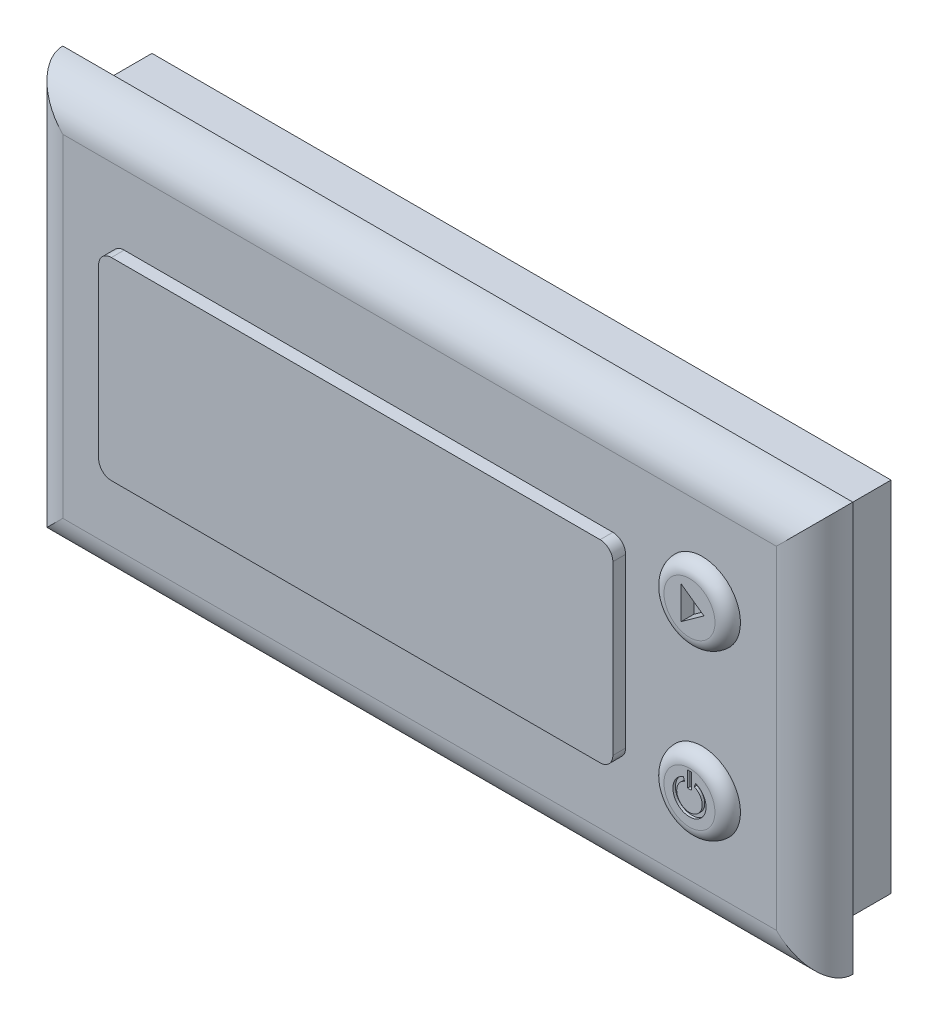
ISO-10303-21;
HEADER;
FILE_DESCRIPTION(('STEP AP214'),'2;1');
FILE_NAME('part.step','',(''),(''),'','','');
FILE_SCHEMA(('AUTOMOTIVE_DESIGN { 1 0 10303 214 1 1 1 1 }'));
ENDSEC;
DATA;
#1=APPLICATION_CONTEXT('core data for automotive mechanical design processes');
#2=APPLICATION_PROTOCOL_DEFINITION('international standard','automotive_design',2000,#1);
#3=PRODUCT_CONTEXT('',#1,'mechanical');
#4=PRODUCT('Part','Part','',(#3));
#5=PRODUCT_RELATED_PRODUCT_CATEGORY('part','',(#4));
#6=PRODUCT_DEFINITION_FORMATION('','',#4);
#7=PRODUCT_DEFINITION_CONTEXT('part definition',#1,'design');
#8=PRODUCT_DEFINITION('design','',#6,#7);
#9=PRODUCT_DEFINITION_SHAPE('','',#8);
#10=(LENGTH_UNIT() NAMED_UNIT(*) SI_UNIT(.MILLI.,.METRE.));
#11=(NAMED_UNIT(*) PLANE_ANGLE_UNIT() SI_UNIT($,.RADIAN.));
#12=(NAMED_UNIT(*) SI_UNIT($,.STERADIAN.) SOLID_ANGLE_UNIT());
#13=UNCERTAINTY_MEASURE_WITH_UNIT(LENGTH_MEASURE(1.E-05),#10,'distance_accuracy_value','');
#14=(GEOMETRIC_REPRESENTATION_CONTEXT(3) GLOBAL_UNCERTAINTY_ASSIGNED_CONTEXT((#13)) GLOBAL_UNIT_ASSIGNED_CONTEXT((#10,
#11,#12)) REPRESENTATION_CONTEXT('',''));
#15=CARTESIAN_POINT('',(0.,0.,0.));
#16=DIRECTION('',(0.,0.,1.));
#17=DIRECTION('',(1.,0.,0.));
#18=AXIS2_PLACEMENT_3D('',#15,#16,#17);
#19=CARTESIAN_POINT('',(0.,0.,8.));
#20=DIRECTION('',(0.,0.,1.));
#21=DIRECTION('',(1.,0.,0.));
#22=AXIS2_PLACEMENT_3D('',#19,#20,#21);
#23=PLANE('',#22);
#24=CARTESIAN_POINT('',(22.1817440953964,-6.44740453375229,8.));
#25=DIRECTION('',(0.,0.,1.));
#26=DIRECTION('',(1.,0.,0.));
#27=AXIS2_PLACEMENT_3D('',#24,#25,#26);
#28=CIRCLE('',#27,3.0006169351865);
#29=CARTESIAN_POINT('',(25.1823610305829,-6.44740453375229,8.));
#30=VERTEX_POINT('',#29);
#31=EDGE_CURVE('E456',#30,#30,#28,.T.);
#32=ORIENTED_EDGE('',*,*,#31,.F.);
#33=EDGE_LOOP('',(#32));
#34=FACE_BOUND('',#33,.T.);
#35=CARTESIAN_POINT('',(22.1817440953964,6.44740453375228,8.));
#36=DIRECTION('',(0.,0.,1.));
#37=DIRECTION('',(1.,0.,0.));
#38=AXIS2_PLACEMENT_3D('',#35,#36,#37);
#39=CIRCLE('',#38,3.0006169351865);
#40=CARTESIAN_POINT('',(25.1823610305829,6.44740453375228,8.));
#41=VERTEX_POINT('',#40);
#42=EDGE_CURVE('E340',#41,#41,#39,.T.);
#43=ORIENTED_EDGE('',*,*,#42,.F.);
#44=EDGE_LOOP('',(#43));
#45=FACE_BOUND('',#44,.T.);
#46=DIRECTION('',(0.,-1.,0.));
#47=VECTOR('',#46,1.);
#48=CARTESIAN_POINT('',(-28.,-16.05,8.));
#49=LINE('',#48,#47);
#50=CARTESIAN_POINT('',(-28.,13.05,8.));
#51=VERTEX_POINT('',#50);
#52=CARTESIAN_POINT('',(-28.,-13.05,8.));
#53=VERTEX_POINT('',#52);
#54=EDGE_CURVE('E449',#51,#53,#49,.T.);
#55=ORIENTED_EDGE('',*,*,#54,.T.);
#56=DIRECTION('',(1.,0.,0.));
#57=VECTOR('',#56,1.);
#58=CARTESIAN_POINT('',(31.,-13.05,8.));
#59=LINE('',#58,#57);
#60=CARTESIAN_POINT('',(28.,-13.05,8.));
#61=VERTEX_POINT('',#60);
#62=EDGE_CURVE('E452',#53,#61,#59,.T.);
#63=ORIENTED_EDGE('',*,*,#62,.T.);
#64=DIRECTION('',(0.,1.,0.));
#65=VECTOR('',#64,1.);
#66=CARTESIAN_POINT('',(28.,16.05,8.));
#67=LINE('',#66,#65);
#68=CARTESIAN_POINT('',(28.,13.05,8.));
#69=VERTEX_POINT('',#68);
#70=EDGE_CURVE('E443',#61,#69,#67,.T.);
#71=ORIENTED_EDGE('',*,*,#70,.T.);
#72=DIRECTION('',(-1.,0.,0.));
#73=VECTOR('',#72,1.);
#74=CARTESIAN_POINT('',(-31.,13.05,8.));
#75=LINE('',#74,#73);
#76=EDGE_CURVE('E446',#69,#51,#75,.T.);
#77=ORIENTED_EDGE('',*,*,#76,.T.);
#78=EDGE_LOOP('',(#55,#63,#71,#77));
#79=FACE_BOUND('',#78,.T.);
#80=DIRECTION('',(1.,0.,0.));
#81=VECTOR('',#80,1.);
#82=CARTESIAN_POINT('',(-24.1861185618479,-7.58321673140807,8.));
#83=LINE('',#82,#81);
#84=CARTESIAN_POINT('',(-23.1861185618479,-7.58321673140807,8.));
#85=VERTEX_POINT('',#84);
#86=CARTESIAN_POINT('',(15.1686206960419,-7.58321673140807,8.));
#87=VERTEX_POINT('',#86);
#88=EDGE_CURVE('E372',#85,#87,#83,.T.);
#89=ORIENTED_EDGE('',*,*,#88,.F.);
#90=CARTESIAN_POINT('',(-23.1861185618479,-6.58321673140807,8.));
#91=DIRECTION('',(0.,0.,1.));
#92=DIRECTION('',(1.,0.,0.));
#93=AXIS2_PLACEMENT_3D('',#90,#91,#92);
#94=CIRCLE('',#93,1.);
#95=CARTESIAN_POINT('',(-24.1861185618479,-6.58321673140807,8.));
#96=VERTEX_POINT('',#95);
#97=EDGE_CURVE('E522',#85,#96,#94,.F.);
#98=ORIENTED_EDGE('',*,*,#97,.T.);
#99=DIRECTION('',(0.,-1.,0.));
#100=VECTOR('',#99,1.);
#101=CARTESIAN_POINT('',(-24.1861185618479,7.58321673140807,8.));
#102=LINE('',#101,#100);
#103=CARTESIAN_POINT('',(-24.1861185618479,6.58321673140807,8.));
#104=VERTEX_POINT('',#103);
#105=EDGE_CURVE('E350',#104,#96,#102,.T.);
#106=ORIENTED_EDGE('',*,*,#105,.F.);
#107=CARTESIAN_POINT('',(-23.1861185618479,6.58321673140807,8.));
#108=DIRECTION('',(0.,0.,1.));
#109=DIRECTION('',(1.,0.,0.));
#110=AXIS2_PLACEMENT_3D('',#107,#108,#109);
#111=CIRCLE('',#110,1.);
#112=CARTESIAN_POINT('',(-23.1861185618479,7.58321673140807,8.));
#113=VERTEX_POINT('',#112);
#114=EDGE_CURVE('E519',#104,#113,#111,.F.);
#115=ORIENTED_EDGE('',*,*,#114,.T.);
#116=DIRECTION('',(1.,0.,0.));
#117=VECTOR('',#116,1.);
#118=CARTESIAN_POINT('',(-24.1861185618479,7.58321673140807,8.));
#119=LINE('',#118,#117);
#120=CARTESIAN_POINT('',(15.1686206960419,7.58321673140807,8.));
#121=VERTEX_POINT('',#120);
#122=EDGE_CURVE('E356',#113,#121,#119,.T.);
#123=ORIENTED_EDGE('',*,*,#122,.T.);
#124=CARTESIAN_POINT('',(15.1686206960419,6.58321673140807,8.));
#125=DIRECTION('',(0.,0.,1.));
#126=DIRECTION('',(1.,0.,0.));
#127=AXIS2_PLACEMENT_3D('',#124,#125,#126);
#128=CIRCLE('',#127,1.);
#129=CARTESIAN_POINT('',(16.1686206960419,6.58321673140807,8.));
#130=VERTEX_POINT('',#129);
#131=EDGE_CURVE('E11',#121,#130,#128,.F.);
#132=ORIENTED_EDGE('',*,*,#131,.T.);
#133=DIRECTION('',(0.,-1.,0.));
#134=VECTOR('',#133,1.);
#135=CARTESIAN_POINT('',(16.1686206960419,7.58321673140807,8.));
#136=LINE('',#135,#134);
#137=CARTESIAN_POINT('',(16.1686206960419,-6.58321673140807,8.));
#138=VERTEX_POINT('',#137);
#139=EDGE_CURVE('E376',#130,#138,#136,.T.);
#140=ORIENTED_EDGE('',*,*,#139,.T.);
#141=CARTESIAN_POINT('',(15.1686206960419,-6.58321673140807,8.));
#142=DIRECTION('',(0.,0.,1.));
#143=DIRECTION('',(1.,0.,0.));
#144=AXIS2_PLACEMENT_3D('',#141,#142,#143);
#145=CIRCLE('',#144,1.);
#146=EDGE_CURVE('E52',#138,#87,#145,.F.);
#147=ORIENTED_EDGE('',*,*,#146,.T.);
#148=EDGE_LOOP('',(#89,#98,#106,#115,#123,#132,#140,#147));
#149=FACE_BOUND('',#148,.T.);
#150=ADVANCED_FACE('F43',(#34,#45,#79,#149),#23,.T.);
#151=CARTESIAN_POINT('',(-29.,-14.05,5.));
#152=DIRECTION('',(1.,0.,0.));
#153=DIRECTION('',(0.,0.,-1.));
#154=AXIS2_PLACEMENT_3D('',#151,#152,#153);
#155=PLANE('',#154);
#156=DIRECTION('',(0.,-1.,0.));
#157=VECTOR('',#156,1.);
#158=CARTESIAN_POINT('',(-29.,-14.05,0.));
#159=LINE('',#158,#157);
#160=CARTESIAN_POINT('',(-29.,14.05,0.));
#161=VERTEX_POINT('',#160);
#162=CARTESIAN_POINT('',(-29.,-14.05,0.));
#163=VERTEX_POINT('',#162);
#164=EDGE_CURVE('E398',#161,#163,#159,.T.);
#165=ORIENTED_EDGE('',*,*,#164,.T.);
#166=DIRECTION('',(0.,0.,-1.));
#167=VECTOR('',#166,1.);
#168=CARTESIAN_POINT('',(-29.,-14.05,5.));
#169=LINE('',#168,#167);
#170=CARTESIAN_POINT('',(-29.,-14.05,5.));
#171=VERTEX_POINT('',#170);
#172=EDGE_CURVE('E439',#171,#163,#169,.T.);
#173=ORIENTED_EDGE('',*,*,#172,.F.);
#174=DIRECTION('',(0.,-1.,0.));
#175=VECTOR('',#174,1.);
#176=CARTESIAN_POINT('',(-29.,-14.05,5.));
#177=LINE('',#176,#175);
#178=CARTESIAN_POINT('',(-29.,14.05,5.));
#179=VERTEX_POINT('',#178);
#180=EDGE_CURVE('E399',#179,#171,#177,.T.);
#181=ORIENTED_EDGE('',*,*,#180,.F.);
#182=DIRECTION('',(0.,0.,-1.));
#183=VECTOR('',#182,1.);
#184=CARTESIAN_POINT('',(-29.,14.05,5.));
#185=LINE('',#184,#183);
#186=EDGE_CURVE('E416',#179,#161,#185,.T.);
#187=ORIENTED_EDGE('',*,*,#186,.T.);
#188=EDGE_LOOP('',(#165,#173,#181,#187));
#189=FACE_BOUND('',#188,.T.);
#190=ADVANCED_FACE('F567',(#189),#155,.F.);
#191=CARTESIAN_POINT('',(29.,-14.05,5.));
#192=DIRECTION('',(0.,1.,0.));
#193=DIRECTION('',(-1.,0.,0.));
#194=AXIS2_PLACEMENT_3D('',#191,#192,#193);
#195=PLANE('',#194);
#196=DIRECTION('',(1.,0.,0.));
#197=VECTOR('',#196,1.);
#198=CARTESIAN_POINT('',(29.,-14.05,0.));
#199=LINE('',#198,#197);
#200=CARTESIAN_POINT('',(29.,-14.05,0.));
#201=VERTEX_POINT('',#200);
#202=EDGE_CURVE('E420',#163,#201,#199,.T.);
#203=ORIENTED_EDGE('',*,*,#202,.T.);
#204=DIRECTION('',(0.,0.,-1.));
#205=VECTOR('',#204,1.);
#206=CARTESIAN_POINT('',(29.,-14.05,5.));
#207=LINE('',#206,#205);
#208=CARTESIAN_POINT('',(29.,-14.05,5.));
#209=VERTEX_POINT('',#208);
#210=EDGE_CURVE('E435',#209,#201,#207,.T.);
#211=ORIENTED_EDGE('',*,*,#210,.F.);
#212=DIRECTION('',(1.,0.,0.));
#213=VECTOR('',#212,1.);
#214=CARTESIAN_POINT('',(29.,-14.05,5.));
#215=LINE('',#214,#213);
#216=EDGE_CURVE('E403',#171,#209,#215,.T.);
#217=ORIENTED_EDGE('',*,*,#216,.F.);
#218=ORIENTED_EDGE('',*,*,#172,.T.);
#219=EDGE_LOOP('',(#203,#211,#217,#218));
#220=FACE_BOUND('',#219,.T.);
#221=ADVANCED_FACE('F573',(#220),#195,.F.);
#222=CARTESIAN_POINT('',(29.,-14.05,5.));
#223=DIRECTION('',(-1.,0.,0.));
#224=DIRECTION('',(0.,0.,1.));
#225=AXIS2_PLACEMENT_3D('',#222,#223,#224);
#226=PLANE('',#225);
#227=DIRECTION('',(0.,1.,0.));
#228=VECTOR('',#227,1.);
#229=CARTESIAN_POINT('',(29.,-14.05,0.));
#230=LINE('',#229,#228);
#231=CARTESIAN_POINT('',(29.,14.05,0.));
#232=VERTEX_POINT('',#231);
#233=EDGE_CURVE('E423',#201,#232,#230,.T.);
#234=ORIENTED_EDGE('',*,*,#233,.T.);
#235=DIRECTION('',(0.,0.,-1.));
#236=VECTOR('',#235,1.);
#237=CARTESIAN_POINT('',(29.,14.05,5.));
#238=LINE('',#237,#236);
#239=CARTESIAN_POINT('',(29.,14.05,5.));
#240=VERTEX_POINT('',#239);
#241=EDGE_CURVE('E431',#240,#232,#238,.T.);
#242=ORIENTED_EDGE('',*,*,#241,.F.);
#243=DIRECTION('',(0.,1.,0.));
#244=VECTOR('',#243,1.);
#245=CARTESIAN_POINT('',(29.,-14.05,5.));
#246=LINE('',#245,#244);
#247=EDGE_CURVE('E408',#209,#240,#246,.T.);
#248=ORIENTED_EDGE('',*,*,#247,.F.);
#249=ORIENTED_EDGE('',*,*,#210,.T.);
#250=EDGE_LOOP('',(#234,#242,#248,#249));
#251=FACE_BOUND('',#250,.T.);
#252=ADVANCED_FACE('F593',(#251),#226,.F.);
#253=CARTESIAN_POINT('',(29.,14.05,5.));
#254=DIRECTION('',(0.,-1.,0.));
#255=DIRECTION('',(1.,0.,0.));
#256=AXIS2_PLACEMENT_3D('',#253,#254,#255);
#257=PLANE('',#256);
#258=DIRECTION('',(-1.,0.,0.));
#259=VECTOR('',#258,1.);
#260=CARTESIAN_POINT('',(29.,14.05,0.));
#261=LINE('',#260,#259);
#262=EDGE_CURVE('E404',#232,#161,#261,.T.);
#263=ORIENTED_EDGE('',*,*,#262,.T.);
#264=ORIENTED_EDGE('',*,*,#186,.F.);
#265=DIRECTION('',(-1.,0.,0.));
#266=VECTOR('',#265,1.);
#267=CARTESIAN_POINT('',(29.,14.05,5.));
#268=LINE('',#267,#266);
#269=EDGE_CURVE('E412',#240,#179,#268,.T.);
#270=ORIENTED_EDGE('',*,*,#269,.F.);
#271=ORIENTED_EDGE('',*,*,#241,.T.);
#272=EDGE_LOOP('',(#263,#264,#270,#271));
#273=FACE_BOUND('',#272,.T.);
#274=ADVANCED_FACE('F589',(#273),#257,.F.);
#275=CARTESIAN_POINT('',(0.,0.,0.));
#276=DIRECTION('',(0.,0.,1.));
#277=DIRECTION('',(1.,0.,0.));
#278=AXIS2_PLACEMENT_3D('',#275,#276,#277);
#279=PLANE('',#278);
#280=ORIENTED_EDGE('',*,*,#164,.F.);
#281=ORIENTED_EDGE('',*,*,#262,.F.);
#282=ORIENTED_EDGE('',*,*,#233,.F.);
#283=ORIENTED_EDGE('',*,*,#202,.F.);
#284=EDGE_LOOP('',(#280,#281,#282,#283));
#285=FACE_BOUND('',#284,.T.);
#286=ADVANCED_FACE('F585',(#285),#279,.F.);
#287=CARTESIAN_POINT('',(0.,0.,5.));
#288=DIRECTION('',(0.,0.,1.));
#289=DIRECTION('',(1.,0.,0.));
#290=AXIS2_PLACEMENT_3D('',#287,#288,#289);
#291=PLANE('',#290);
#292=DIRECTION('',(0.,1.,0.));
#293=VECTOR('',#292,1.);
#294=CARTESIAN_POINT('',(31.,-16.05,5.));
#295=LINE('',#294,#293);
#296=CARTESIAN_POINT('',(31.,-16.05,5.));
#297=VERTEX_POINT('',#296);
#298=CARTESIAN_POINT('',(31.,16.05,5.));
#299=VERTEX_POINT('',#298);
#300=EDGE_CURVE('E381',#297,#299,#295,.T.);
#301=ORIENTED_EDGE('',*,*,#300,.F.);
#302=DIRECTION('',(1.,0.,0.));
#303=VECTOR('',#302,1.);
#304=CARTESIAN_POINT('',(-31.,-16.05,5.));
#305=LINE('',#304,#303);
#306=CARTESIAN_POINT('',(-31.,-16.05,5.));
#307=VERTEX_POINT('',#306);
#308=EDGE_CURVE('E394',#307,#297,#305,.T.);
#309=ORIENTED_EDGE('',*,*,#308,.F.);
#310=DIRECTION('',(0.,-1.,0.));
#311=VECTOR('',#310,1.);
#312=CARTESIAN_POINT('',(-31.,16.05,5.));
#313=LINE('',#312,#311);
#314=CARTESIAN_POINT('',(-31.,16.05,5.));
#315=VERTEX_POINT('',#314);
#316=EDGE_CURVE('E390',#315,#307,#313,.T.);
#317=ORIENTED_EDGE('',*,*,#316,.F.);
#318=DIRECTION('',(-1.,0.,0.));
#319=VECTOR('',#318,1.);
#320=CARTESIAN_POINT('',(31.,16.05,5.));
#321=LINE('',#320,#319);
#322=EDGE_CURVE('E385',#299,#315,#321,.T.);
#323=ORIENTED_EDGE('',*,*,#322,.F.);
#324=EDGE_LOOP('',(#301,#309,#317,#323));
#325=FACE_BOUND('',#324,.T.);
#326=ORIENTED_EDGE('',*,*,#269,.T.);
#327=ORIENTED_EDGE('',*,*,#180,.T.);
#328=ORIENTED_EDGE('',*,*,#216,.T.);
#329=ORIENTED_EDGE('',*,*,#247,.T.);
#330=EDGE_LOOP('',(#326,#327,#328,#329));
#331=FACE_BOUND('',#330,.T.);
#332=ADVANCED_FACE('F581',(#325,#331),#291,.F.);
#333=CARTESIAN_POINT('',(0.,13.05,5.));
#334=DIRECTION('',(1.,0.,0.));
#335=DIRECTION('',(0.,0.,-1.));
#336=AXIS2_PLACEMENT_3D('',#333,#334,#335);
#337=CYLINDRICAL_SURFACE('',#336,3.);
#338=CARTESIAN_POINT('',(28.,13.05,5.));
#339=DIRECTION('',(0.707106781186547,-0.707106781186547,0.));
#340=DIRECTION('',(-0.707106781186547,-0.707106781186547,0.));
#341=AXIS2_PLACEMENT_3D('',#338,#339,#340);
#342=ELLIPSE('',#341,4.24264068711928,3.);
#343=EDGE_CURVE('E462',#299,#69,#342,.T.);
#344=ORIENTED_EDGE('',*,*,#343,.F.);
#345=ORIENTED_EDGE('',*,*,#322,.T.);
#346=CARTESIAN_POINT('',(-28.,13.05,5.));
#347=DIRECTION('',(0.707106781186547,0.707106781186547,0.));
#348=DIRECTION('',(0.707106781186547,-0.707106781186547,0.));
#349=AXIS2_PLACEMENT_3D('',#346,#347,#348);
#350=ELLIPSE('',#349,4.24264068711928,3.);
#351=EDGE_CURVE('E386',#51,#315,#350,.F.);
#352=ORIENTED_EDGE('',*,*,#351,.F.);
#353=ORIENTED_EDGE('',*,*,#76,.F.);
#354=EDGE_LOOP('',(#344,#345,#352,#353));
#355=FACE_BOUND('',#354,.T.);
#356=ADVANCED_FACE('F584',(#355),#337,.T.);
#357=CARTESIAN_POINT('',(-28.,0.,5.));
#358=DIRECTION('',(0.,1.,0.));
#359=DIRECTION('',(0.,0.,1.));
#360=AXIS2_PLACEMENT_3D('',#357,#358,#359);
#361=CYLINDRICAL_SURFACE('',#360,3.);
#362=ORIENTED_EDGE('',*,*,#351,.T.);
#363=ORIENTED_EDGE('',*,*,#316,.T.);
#364=CARTESIAN_POINT('',(-28.,-13.05,5.));
#365=DIRECTION('',(-0.707106781186547,0.707106781186547,0.));
#366=DIRECTION('',(0.707106781186547,0.707106781186547,0.));
#367=AXIS2_PLACEMENT_3D('',#364,#365,#366);
#368=ELLIPSE('',#367,4.24264068711928,3.);
#369=EDGE_CURVE('E459',#53,#307,#368,.F.);
#370=ORIENTED_EDGE('',*,*,#369,.F.);
#371=ORIENTED_EDGE('',*,*,#54,.F.);
#372=EDGE_LOOP('',(#362,#363,#370,#371));
#373=FACE_BOUND('',#372,.T.);
#374=ADVANCED_FACE('F608',(#373),#361,.T.);
#375=CARTESIAN_POINT('',(28.,0.,5.));
#376=DIRECTION('',(0.,-1.,0.));
#377=DIRECTION('',(0.,0.,-1.));
#378=AXIS2_PLACEMENT_3D('',#375,#376,#377);
#379=CYLINDRICAL_SURFACE('',#378,3.);
#380=ORIENTED_EDGE('',*,*,#343,.T.);
#381=ORIENTED_EDGE('',*,*,#70,.F.);
#382=CARTESIAN_POINT('',(28.,-13.05,5.));
#383=DIRECTION('',(-0.707106781186547,-0.707106781186547,0.));
#384=DIRECTION('',(0.707106781186547,-0.707106781186547,0.));
#385=AXIS2_PLACEMENT_3D('',#382,#383,#384);
#386=ELLIPSE('',#385,4.24264068711928,3.);
#387=EDGE_CURVE('E368',#297,#61,#386,.T.);
#388=ORIENTED_EDGE('',*,*,#387,.F.);
#389=ORIENTED_EDGE('',*,*,#300,.T.);
#390=EDGE_LOOP('',(#380,#381,#388,#389));
#391=FACE_BOUND('',#390,.T.);
#392=ADVANCED_FACE('F604',(#391),#379,.T.);
#393=CARTESIAN_POINT('',(0.,-13.05,5.));
#394=DIRECTION('',(-1.,0.,0.));
#395=DIRECTION('',(0.,0.,1.));
#396=AXIS2_PLACEMENT_3D('',#393,#394,#395);
#397=CYLINDRICAL_SURFACE('',#396,3.);
#398=ORIENTED_EDGE('',*,*,#369,.T.);
#399=ORIENTED_EDGE('',*,*,#308,.T.);
#400=ORIENTED_EDGE('',*,*,#387,.T.);
#401=ORIENTED_EDGE('',*,*,#62,.F.);
#402=EDGE_LOOP('',(#398,#399,#400,#401));
#403=FACE_BOUND('',#402,.T.);
#404=ADVANCED_FACE('F601',(#403),#397,.T.);
#405=CARTESIAN_POINT('',(-24.1861185618479,7.58321673140807,9.));
#406=DIRECTION('',(1.,0.,0.));
#407=DIRECTION('',(0.,0.,-1.));
#408=AXIS2_PLACEMENT_3D('',#405,#406,#407);
#409=PLANE('',#408);
#410=DIRECTION('',(0.,-1.,0.));
#411=VECTOR('',#410,1.);
#412=CARTESIAN_POINT('',(-24.1861185618479,7.58321673140807,9.));
#413=LINE('',#412,#411);
#414=CARTESIAN_POINT('',(-24.1861185618479,6.58321673140807,9.));
#415=VERTEX_POINT('',#414);
#416=CARTESIAN_POINT('',(-24.1861185618479,-6.58321673140807,9.));
#417=VERTEX_POINT('',#416);
#418=EDGE_CURVE('E351',#415,#417,#413,.T.);
#419=ORIENTED_EDGE('',*,*,#418,.F.);
#420=DIRECTION('',(0.,0.,-1.));
#421=VECTOR('',#420,1.);
#422=CARTESIAN_POINT('',(-24.1861185618479,6.58321673140807,8.));
#423=LINE('',#422,#421);
#424=EDGE_CURVE('E483',#415,#104,#423,.T.);
#425=ORIENTED_EDGE('',*,*,#424,.T.);
#426=ORIENTED_EDGE('',*,*,#105,.T.);
#427=DIRECTION('',(0.,0.,-1.));
#428=VECTOR('',#427,1.);
#429=CARTESIAN_POINT('',(-24.1861185618479,-6.58321673140807,9.));
#430=LINE('',#429,#428);
#431=EDGE_CURVE('E480',#96,#417,#430,.F.);
#432=ORIENTED_EDGE('',*,*,#431,.T.);
#433=EDGE_LOOP('',(#419,#425,#426,#432));
#434=FACE_BOUND('',#433,.T.);
#435=ADVANCED_FACE('F553',(#434),#409,.F.);
#436=CARTESIAN_POINT('',(-24.1861185618479,-7.58321673140807,9.));
#437=DIRECTION('',(0.,1.,0.));
#438=DIRECTION('',(0.,0.,1.));
#439=AXIS2_PLACEMENT_3D('',#436,#437,#438);
#440=PLANE('',#439);
#441=DIRECTION('',(1.,0.,0.));
#442=VECTOR('',#441,1.);
#443=CARTESIAN_POINT('',(-24.1861185618479,-7.58321673140807,9.));
#444=LINE('',#443,#442);
#445=CARTESIAN_POINT('',(-23.1861185618479,-7.58321673140807,9.));
#446=VERTEX_POINT('',#445);
#447=CARTESIAN_POINT('',(15.1686206960419,-7.58321673140807,9.));
#448=VERTEX_POINT('',#447);
#449=EDGE_CURVE('E355',#446,#448,#444,.T.);
#450=ORIENTED_EDGE('',*,*,#449,.F.);
#451=DIRECTION('',(0.,0.,-1.));
#452=VECTOR('',#451,1.);
#453=CARTESIAN_POINT('',(-23.1861185618479,-7.58321673140807,9.));
#454=LINE('',#453,#452);
#455=EDGE_CURVE('E509',#446,#85,#454,.T.);
#456=ORIENTED_EDGE('',*,*,#455,.T.);
#457=ORIENTED_EDGE('',*,*,#88,.T.);
#458=DIRECTION('',(0.,0.,-1.));
#459=VECTOR('',#458,1.);
#460=CARTESIAN_POINT('',(15.1686206960419,-7.58321673140807,9.));
#461=LINE('',#460,#459);
#462=EDGE_CURVE('E506',#87,#448,#461,.F.);
#463=ORIENTED_EDGE('',*,*,#462,.T.);
#464=EDGE_LOOP('',(#450,#456,#457,#463));
#465=FACE_BOUND('',#464,.T.);
#466=ADVANCED_FACE('F528',(#465),#440,.F.);
#467=CARTESIAN_POINT('',(16.1686206960419,7.58321673140807,9.));
#468=DIRECTION('',(1.,0.,0.));
#469=DIRECTION('',(0.,0.,-1.));
#470=AXIS2_PLACEMENT_3D('',#467,#468,#469);
#471=PLANE('',#470);
#472=DIRECTION('',(0.,-1.,0.));
#473=VECTOR('',#472,1.);
#474=CARTESIAN_POINT('',(16.1686206960419,7.58321673140807,9.));
#475=LINE('',#474,#473);
#476=CARTESIAN_POINT('',(16.1686206960419,6.58321673140807,9.));
#477=VERTEX_POINT('',#476);
#478=CARTESIAN_POINT('',(16.1686206960419,-6.58321673140807,9.));
#479=VERTEX_POINT('',#478);
#480=EDGE_CURVE('E360',#477,#479,#475,.T.);
#481=ORIENTED_EDGE('',*,*,#480,.T.);
#482=DIRECTION('',(0.,0.,-1.));
#483=VECTOR('',#482,1.);
#484=CARTESIAN_POINT('',(16.1686206960419,-6.58321673140807,8.));
#485=LINE('',#484,#483);
#486=EDGE_CURVE('E516',#479,#138,#485,.T.);
#487=ORIENTED_EDGE('',*,*,#486,.T.);
#488=ORIENTED_EDGE('',*,*,#139,.F.);
#489=DIRECTION('',(0.,0.,-1.));
#490=VECTOR('',#489,1.);
#491=CARTESIAN_POINT('',(16.1686206960419,6.58321673140807,9.));
#492=LINE('',#491,#490);
#493=EDGE_CURVE('E513',#130,#477,#492,.F.);
#494=ORIENTED_EDGE('',*,*,#493,.T.);
#495=EDGE_LOOP('',(#481,#487,#488,#494));
#496=FACE_BOUND('',#495,.T.);
#497=ADVANCED_FACE('F538',(#496),#471,.T.);
#498=CARTESIAN_POINT('',(-24.1861185618479,7.58321673140807,9.));
#499=DIRECTION('',(0.,1.,0.));
#500=DIRECTION('',(0.,0.,1.));
#501=AXIS2_PLACEMENT_3D('',#498,#499,#500);
#502=PLANE('',#501);
#503=ORIENTED_EDGE('',*,*,#122,.F.);
#504=DIRECTION('',(0.,0.,-1.));
#505=VECTOR('',#504,1.);
#506=CARTESIAN_POINT('',(-23.1861185618479,7.58321673140807,9.));
#507=LINE('',#506,#505);
#508=CARTESIAN_POINT('',(-23.1861185618479,7.58321673140807,9.));
#509=VERTEX_POINT('',#508);
#510=EDGE_CURVE('E491',#113,#509,#507,.F.);
#511=ORIENTED_EDGE('',*,*,#510,.T.);
#512=DIRECTION('',(1.,0.,0.));
#513=VECTOR('',#512,1.);
#514=CARTESIAN_POINT('',(-24.1861185618479,7.58321673140807,9.));
#515=LINE('',#514,#513);
#516=CARTESIAN_POINT('',(15.1686206960419,7.58321673140807,9.));
#517=VERTEX_POINT('',#516);
#518=EDGE_CURVE('E364',#509,#517,#515,.T.);
#519=ORIENTED_EDGE('',*,*,#518,.T.);
#520=DIRECTION('',(0.,0.,-1.));
#521=VECTOR('',#520,1.);
#522=CARTESIAN_POINT('',(15.1686206960419,7.58321673140807,9.));
#523=LINE('',#522,#521);
#524=EDGE_CURVE('E487',#517,#121,#523,.T.);
#525=ORIENTED_EDGE('',*,*,#524,.T.);
#526=EDGE_LOOP('',(#503,#511,#519,#525));
#527=FACE_BOUND('',#526,.T.);
#528=ADVANCED_FACE('F545',(#527),#502,.T.);
#529=CARTESIAN_POINT('',(0.,0.,9.));
#530=DIRECTION('',(0.,0.,1.));
#531=DIRECTION('',(1.,0.,0.));
#532=AXIS2_PLACEMENT_3D('',#529,#530,#531);
#533=PLANE('',#532);
#534=ORIENTED_EDGE('',*,*,#518,.F.);
#535=CARTESIAN_POINT('',(-23.1861185618479,6.58321673140807,9.));
#536=DIRECTION('',(0.,0.,1.));
#537=DIRECTION('',(1.,0.,0.));
#538=AXIS2_PLACEMENT_3D('',#535,#536,#537);
#539=CIRCLE('',#538,1.);
#540=EDGE_CURVE('E503',#509,#415,#539,.T.);
#541=ORIENTED_EDGE('',*,*,#540,.T.);
#542=ORIENTED_EDGE('',*,*,#418,.T.);
#543=CARTESIAN_POINT('',(-23.1861185618479,-6.58321673140807,9.));
#544=DIRECTION('',(0.,0.,1.));
#545=DIRECTION('',(1.,0.,0.));
#546=AXIS2_PLACEMENT_3D('',#543,#544,#545);
#547=CIRCLE('',#546,1.);
#548=EDGE_CURVE('E500',#417,#446,#547,.T.);
#549=ORIENTED_EDGE('',*,*,#548,.T.);
#550=ORIENTED_EDGE('',*,*,#449,.T.);
#551=CARTESIAN_POINT('',(15.1686206960419,-6.58321673140807,9.));
#552=DIRECTION('',(0.,0.,1.));
#553=DIRECTION('',(1.,0.,0.));
#554=AXIS2_PLACEMENT_3D('',#551,#552,#553);
#555=CIRCLE('',#554,1.);
#556=EDGE_CURVE('E497',#448,#479,#555,.T.);
#557=ORIENTED_EDGE('',*,*,#556,.T.);
#558=ORIENTED_EDGE('',*,*,#480,.F.);
#559=CARTESIAN_POINT('',(15.1686206960419,6.58321673140807,9.));
#560=DIRECTION('',(0.,0.,1.));
#561=DIRECTION('',(1.,0.,0.));
#562=AXIS2_PLACEMENT_3D('',#559,#560,#561);
#563=CIRCLE('',#562,1.);
#564=EDGE_CURVE('E494',#477,#517,#563,.T.);
#565=ORIENTED_EDGE('',*,*,#564,.T.);
#566=EDGE_LOOP('',(#534,#541,#542,#549,#550,#557,#558,#565));
#567=FACE_BOUND('',#566,.T.);
#568=ADVANCED_FACE('F535',(#567),#533,.T.);
#569=CARTESIAN_POINT('',(22.1817440953964,6.44740453375228,9.));
#570=DIRECTION('',(0.,0.,1.));
#571=DIRECTION('',(1.,0.,0.));
#572=AXIS2_PLACEMENT_3D('',#569,#570,#571);
#573=PLANE('',#572);
#574=DIRECTION('',(-0.811426701102146,0.584454197297348,0.));
#575=VECTOR('',#574,1.);
#576=CARTESIAN_POINT('',(23.3128165683666,6.477292894176,9.));
#577=LINE('',#576,#575);
#578=CARTESIAN_POINT('',(23.3128165683666,6.477292894176,9.));
#579=VERTEX_POINT('',#578);
#580=CARTESIAN_POINT('',(21.526754793678,7.76375696965095,9.));
#581=VERTEX_POINT('',#580);
#582=EDGE_CURVE('E304',#579,#581,#577,.T.);
#583=ORIENTED_EDGE('',*,*,#582,.F.);
#584=DIRECTION('',(0.811426701102146,0.584454197297349,0.));
#585=VECTOR('',#584,1.);
#586=CARTESIAN_POINT('',(21.526754793678,5.19082881870105,9.));
#587=LINE('',#586,#585);
#588=CARTESIAN_POINT('',(21.526754793678,5.19082881870105,9.));
#589=VERTEX_POINT('',#588);
#590=EDGE_CURVE('E319',#589,#579,#587,.T.);
#591=ORIENTED_EDGE('',*,*,#590,.F.);
#592=DIRECTION('',(0.,-1.,0.));
#593=VECTOR('',#592,1.);
#594=CARTESIAN_POINT('',(21.526754793678,7.76375696965095,9.));
#595=LINE('',#594,#593);
#596=EDGE_CURVE('E330',#581,#589,#595,.T.);
#597=ORIENTED_EDGE('',*,*,#596,.F.);
#598=EDGE_LOOP('',(#583,#591,#597));
#599=FACE_BOUND('',#598,.T.);
#600=CARTESIAN_POINT('',(22.1817440953964,6.44740453375228,9.));
#601=DIRECTION('',(0.,0.,1.));
#602=DIRECTION('',(1.,0.,0.));
#603=AXIS2_PLACEMENT_3D('',#600,#601,#602);
#604=CIRCLE('',#603,2.0006169351865);
#605=CARTESIAN_POINT('',(24.1823610305829,6.44740453375228,9.));
#606=VERTEX_POINT('',#605);
#607=EDGE_CURVE('E476',#606,#606,#604,.T.);
#608=ORIENTED_EDGE('',*,*,#607,.T.);
#609=EDGE_LOOP('',(#608));
#610=FACE_BOUND('',#609,.T.);
#611=ADVANCED_FACE('F634',(#599,#610),#573,.T.);
#612=CARTESIAN_POINT('',(22.1817440953964,-6.44740453375229,9.));
#613=DIRECTION('',(0.,0.,-1.));
#614=DIRECTION('',(-1.,0.,0.));
#615=AXIS2_PLACEMENT_3D('',#612,#613,#614);
#616=PLANE('',#615);
#617=DIRECTION('',(0.,-1.,0.));
#618=VECTOR('',#617,1.);
#619=CARTESIAN_POINT('',(22.0317440953964,-5.86984139024639,9.));
#620=LINE('',#619,#618);
#621=CARTESIAN_POINT('',(22.0317440953964,-4.63123862337543,9.));
#622=VERTEX_POINT('',#621);
#623=CARTESIAN_POINT('',(22.0317440953964,-5.86984139024639,9.));
#624=VERTEX_POINT('',#623);
#625=EDGE_CURVE('E248',#622,#624,#620,.T.);
#626=ORIENTED_EDGE('',*,*,#625,.F.);
#627=CARTESIAN_POINT('',(22.1817440953964,-6.44740453375229,9.));
#628=DIRECTION('',(0.,0.,1.));
#629=DIRECTION('',(1.,0.,0.));
#630=AXIS2_PLACEMENT_3D('',#627,#628,#629);
#631=CIRCLE('',#630,1.82234975073804);
#632=CARTESIAN_POINT('',(22.3317440953964,-4.63123862337543,9.));
#633=VERTEX_POINT('',#632);
#634=EDGE_CURVE('E225',#633,#622,#631,.T.);
#635=ORIENTED_EDGE('',*,*,#634,.F.);
#636=DIRECTION('',(0.,1.,0.));
#637=VECTOR('',#636,1.);
#638=CARTESIAN_POINT('',(22.3317440953964,-5.86984139024639,9.));
#639=LINE('',#638,#637);
#640=CARTESIAN_POINT('',(22.3317440953964,-5.86984139024639,9.));
#641=VERTEX_POINT('',#640);
#642=EDGE_CURVE('E236',#641,#633,#639,.T.);
#643=ORIENTED_EDGE('',*,*,#642,.F.);
#644=DIRECTION('',(1.,0.,0.));
#645=VECTOR('',#644,1.);
#646=CARTESIAN_POINT('',(22.0317440953964,-5.86984139024639,9.));
#647=LINE('',#646,#645);
#648=EDGE_CURVE('E242',#624,#641,#647,.T.);
#649=ORIENTED_EDGE('',*,*,#648,.F.);
#650=EDGE_LOOP('',(#626,#635,#643,#649));
#651=FACE_BOUND('',#650,.T.);
#652=DIRECTION('',(-0.343192952923546,-0.939264923790736,0.));
#653=VECTOR('',#652,1.);
#654=CARTESIAN_POINT('',(22.6626811882106,-5.2389741779397,9.));
#655=LINE('',#654,#653);
#656=CARTESIAN_POINT('',(22.6626811882106,-5.2389741779397,9.));
#657=VERTEX_POINT('',#656);
#658=CARTESIAN_POINT('',(22.5596690989168,-5.52090200127,9.));
#659=VERTEX_POINT('',#658);
#660=EDGE_CURVE('E254',#657,#659,#655,.T.);
#661=ORIENTED_EDGE('',*,*,#660,.F.);
#662=CARTESIAN_POINT('',(22.1817440953964,-6.44740453375229,9.));
#663=DIRECTION('',(0.,0.,1.));
#664=DIRECTION('',(1.,0.,0.));
#665=AXIS2_PLACEMENT_3D('',#662,#663,#664);
#666=CIRCLE('',#665,1.3006169351865);
#667=CARTESIAN_POINT('',(21.7008070025821,-5.2389741779397,9.));
#668=VERTEX_POINT('',#667);
#669=EDGE_CURVE('E250',#668,#657,#666,.T.);
#670=ORIENTED_EDGE('',*,*,#669,.F.);
#671=DIRECTION('',(-0.343192952923546,0.939264923790736,0.));
#672=VECTOR('',#671,1.);
#673=CARTESIAN_POINT('',(21.7008070025821,-5.2389741779397,9.));
#674=LINE('',#673,#672);
#675=CARTESIAN_POINT('',(21.8038190918759,-5.52090200127,9.));
#676=VERTEX_POINT('',#675);
#677=EDGE_CURVE('E278',#676,#668,#674,.T.);
#678=ORIENTED_EDGE('',*,*,#677,.F.);
#679=CARTESIAN_POINT('',(22.1817440953964,-6.44740453375229,9.));
#680=DIRECTION('',(0.,0.,-1.));
#681=DIRECTION('',(1.,0.,0.));
#682=AXIS2_PLACEMENT_3D('',#679,#680,#681);
#683=CIRCLE('',#682,1.0006169351865);
#684=EDGE_CURVE('E294',#659,#676,#683,.T.);
#685=ORIENTED_EDGE('',*,*,#684,.F.);
#686=EDGE_LOOP('',(#661,#670,#678,#685));
#687=FACE_BOUND('',#686,.T.);
#688=CARTESIAN_POINT('',(22.1817440953964,-6.44740453375229,9.));
#689=DIRECTION('',(0.,0.,-1.));
#690=DIRECTION('',(-1.,0.,0.));
#691=AXIS2_PLACEMENT_3D('',#688,#689,#690);
#692=CIRCLE('',#691,2.0006169351865);
#693=CARTESIAN_POINT('',(20.1811271602099,-6.44740453375229,9.));
#694=VERTEX_POINT('',#693);
#695=EDGE_CURVE('E472',#694,#694,#692,.F.);
#696=ORIENTED_EDGE('',*,*,#695,.T.);
#697=EDGE_LOOP('',(#696));
#698=FACE_BOUND('',#697,.T.);
#699=ADVANCED_FACE('F245',(#651,#687,#698),#616,.F.);
#700=CARTESIAN_POINT('',(22.1817440953964,-6.44740453375229,8.));
#701=DIRECTION('',(0.,0.,-1.));
#702=DIRECTION('',(-1.,0.,0.));
#703=AXIS2_PLACEMENT_3D('',#700,#701,#702);
#704=TOROIDAL_SURFACE('',#703,2.0006169351865,1.);
#705=ORIENTED_EDGE('',*,*,#695,.F.);
#706=EDGE_LOOP('',(#705));
#707=FACE_BOUND('',#706,.T.);
#708=ORIENTED_EDGE('',*,*,#31,.T.);
#709=EDGE_LOOP('',(#708));
#710=FACE_BOUND('',#709,.T.);
#711=ADVANCED_FACE('F616',(#707,#710),#704,.T.);
#712=CARTESIAN_POINT('',(22.1817440953964,6.44740453375228,8.));
#713=DIRECTION('',(0.,0.,1.));
#714=DIRECTION('',(1.,0.,0.));
#715=AXIS2_PLACEMENT_3D('',#712,#713,#714);
#716=TOROIDAL_SURFACE('',#715,2.0006169351865,1.);
#717=ORIENTED_EDGE('',*,*,#42,.T.);
#718=EDGE_LOOP('',(#717));
#719=FACE_BOUND('',#718,.T.);
#720=ORIENTED_EDGE('',*,*,#607,.F.);
#721=EDGE_LOOP('',(#720));
#722=FACE_BOUND('',#721,.T.);
#723=ADVANCED_FACE('F619',(#719,#722),#716,.T.);
#724=CARTESIAN_POINT('',(23.3128165683666,6.477292894176,8.));
#725=DIRECTION('',(0.584454197297348,0.811426701102146,0.));
#726=DIRECTION('',(-0.811426701102146,0.584454197297348,0.));
#727=AXIS2_PLACEMENT_3D('',#724,#725,#726);
#728=PLANE('',#727);
#729=ORIENTED_EDGE('',*,*,#582,.T.);
#730=DIRECTION('',(0.,0.,1.));
#731=VECTOR('',#730,1.);
#732=CARTESIAN_POINT('',(21.526754793678,7.76375696965095,8.));
#733=LINE('',#732,#731);
#734=CARTESIAN_POINT('',(21.526754793678,7.76375696965095,8.));
#735=VERTEX_POINT('',#734);
#736=EDGE_CURVE('E327',#735,#581,#733,.T.);
#737=ORIENTED_EDGE('',*,*,#736,.F.);
#738=DIRECTION('',(-0.811426701102146,0.584454197297348,0.));
#739=VECTOR('',#738,1.);
#740=CARTESIAN_POINT('',(23.3128165683666,6.477292894176,8.));
#741=LINE('',#740,#739);
#742=CARTESIAN_POINT('',(23.3128165683666,6.477292894176,8.));
#743=VERTEX_POINT('',#742);
#744=EDGE_CURVE('E314',#743,#735,#741,.T.);
#745=ORIENTED_EDGE('',*,*,#744,.F.);
#746=DIRECTION('',(0.,0.,1.));
#747=VECTOR('',#746,1.);
#748=CARTESIAN_POINT('',(23.3128165683666,6.477292894176,8.));
#749=LINE('',#748,#747);
#750=EDGE_CURVE('E337',#743,#579,#749,.T.);
#751=ORIENTED_EDGE('',*,*,#750,.T.);
#752=EDGE_LOOP('',(#729,#737,#745,#751));
#753=FACE_BOUND('',#752,.T.);
#754=ADVANCED_FACE('F622',(#753),#728,.F.);
#755=CARTESIAN_POINT('',(21.526754793678,5.19082881870105,8.));
#756=DIRECTION('',(0.584454197297349,-0.811426701102146,0.));
#757=DIRECTION('',(0.811426701102146,0.584454197297349,0.));
#758=AXIS2_PLACEMENT_3D('',#755,#756,#757);
#759=PLANE('',#758);
#760=ORIENTED_EDGE('',*,*,#590,.T.);
#761=ORIENTED_EDGE('',*,*,#750,.F.);
#762=DIRECTION('',(0.811426701102146,0.584454197297349,0.));
#763=VECTOR('',#762,1.);
#764=CARTESIAN_POINT('',(21.526754793678,5.19082881870105,8.));
#765=LINE('',#764,#763);
#766=CARTESIAN_POINT('',(21.526754793678,5.19082881870105,8.));
#767=VERTEX_POINT('',#766);
#768=EDGE_CURVE('E323',#767,#743,#765,.T.);
#769=ORIENTED_EDGE('',*,*,#768,.F.);
#770=DIRECTION('',(0.,0.,1.));
#771=VECTOR('',#770,1.);
#772=CARTESIAN_POINT('',(21.526754793678,5.19082881870105,8.));
#773=LINE('',#772,#771);
#774=EDGE_CURVE('E341',#767,#589,#773,.T.);
#775=ORIENTED_EDGE('',*,*,#774,.T.);
#776=EDGE_LOOP('',(#760,#761,#769,#775));
#777=FACE_BOUND('',#776,.T.);
#778=ADVANCED_FACE('F627',(#777),#759,.F.);
#779=CARTESIAN_POINT('',(21.526754793678,7.76375696965095,8.));
#780=DIRECTION('',(-1.,0.,0.));
#781=DIRECTION('',(0.,0.,1.));
#782=AXIS2_PLACEMENT_3D('',#779,#780,#781);
#783=PLANE('',#782);
#784=ORIENTED_EDGE('',*,*,#596,.T.);
#785=ORIENTED_EDGE('',*,*,#774,.F.);
#786=DIRECTION('',(0.,-1.,0.));
#787=VECTOR('',#786,1.);
#788=CARTESIAN_POINT('',(21.526754793678,7.76375696965095,8.));
#789=LINE('',#788,#787);
#790=EDGE_CURVE('E318',#735,#767,#789,.T.);
#791=ORIENTED_EDGE('',*,*,#790,.F.);
#792=ORIENTED_EDGE('',*,*,#736,.T.);
#793=EDGE_LOOP('',(#784,#785,#791,#792));
#794=FACE_BOUND('',#793,.T.);
#795=ADVANCED_FACE('F816',(#794),#783,.F.);
#796=CARTESIAN_POINT('',(0.,0.,8.));
#797=DIRECTION('',(0.,0.,-1.));
#798=DIRECTION('',(-1.,0.,0.));
#799=AXIS2_PLACEMENT_3D('',#796,#797,#798);
#800=PLANE('',#799);
#801=ORIENTED_EDGE('',*,*,#744,.T.);
#802=ORIENTED_EDGE('',*,*,#790,.T.);
#803=ORIENTED_EDGE('',*,*,#768,.T.);
#804=EDGE_LOOP('',(#801,#802,#803));
#805=FACE_BOUND('',#804,.T.);
#806=ADVANCED_FACE('F827',(#805),#800,.F.);
#807=CARTESIAN_POINT('',(22.1817440953964,-6.44740453375229,8.8));
#808=DIRECTION('',(0.,0.,1.));
#809=DIRECTION('',(1.,0.,0.));
#810=AXIS2_PLACEMENT_3D('',#807,#808,#809);
#811=CYLINDRICAL_SURFACE('',#810,1.3006169351865);
#812=ORIENTED_EDGE('',*,*,#669,.T.);
#813=DIRECTION('',(0.,0.,1.));
#814=VECTOR('',#813,1.);
#815=CARTESIAN_POINT('',(22.6626811882106,-5.2389741779397,8.8));
#816=LINE('',#815,#814);
#817=CARTESIAN_POINT('',(22.6626811882106,-5.2389741779397,8.8));
#818=VERTEX_POINT('',#817);
#819=EDGE_CURVE('E289',#818,#657,#816,.T.);
#820=ORIENTED_EDGE('',*,*,#819,.F.);
#821=CARTESIAN_POINT('',(22.1817440953964,-6.44740453375229,8.8));
#822=DIRECTION('',(0.,0.,1.));
#823=DIRECTION('',(1.,0.,0.));
#824=AXIS2_PLACEMENT_3D('',#821,#822,#823);
#825=CIRCLE('',#824,1.3006169351865);
#826=CARTESIAN_POINT('',(21.7008070025821,-5.2389741779397,8.8));
#827=VERTEX_POINT('',#826);
#828=EDGE_CURVE('E273',#827,#818,#825,.T.);
#829=ORIENTED_EDGE('',*,*,#828,.F.);
#830=DIRECTION('',(0.,0.,1.));
#831=VECTOR('',#830,1.);
#832=CARTESIAN_POINT('',(21.7008070025821,-5.2389741779397,8.8));
#833=LINE('',#832,#831);
#834=EDGE_CURVE('E301',#827,#668,#833,.T.);
#835=ORIENTED_EDGE('',*,*,#834,.T.);
#836=EDGE_LOOP('',(#812,#820,#829,#835));
#837=FACE_BOUND('',#836,.T.);
#838=ADVANCED_FACE('F837',(#837),#811,.F.);
#839=CARTESIAN_POINT('',(21.7008070025821,-5.2389741779397,8.8));
#840=DIRECTION('',(0.939264923790736,0.343192952923547,0.));
#841=DIRECTION('',(-0.343192952923547,0.939264923790736,0.));
#842=AXIS2_PLACEMENT_3D('',#839,#840,#841);
#843=PLANE('',#842);
#844=ORIENTED_EDGE('',*,*,#677,.T.);
#845=ORIENTED_EDGE('',*,*,#834,.F.);
#846=DIRECTION('',(-0.343192952923546,0.939264923790736,0.));
#847=VECTOR('',#846,1.);
#848=CARTESIAN_POINT('',(21.7008070025821,-5.2389741779397,8.8));
#849=LINE('',#848,#847);
#850=CARTESIAN_POINT('',(21.8038190918759,-5.52090200127,8.8));
#851=VERTEX_POINT('',#850);
#852=EDGE_CURVE('E286',#851,#827,#849,.T.);
#853=ORIENTED_EDGE('',*,*,#852,.F.);
#854=DIRECTION('',(0.,0.,1.));
#855=VECTOR('',#854,1.);
#856=CARTESIAN_POINT('',(21.8038190918759,-5.52090200127,8.8));
#857=LINE('',#856,#855);
#858=EDGE_CURVE('E305',#851,#676,#857,.T.);
#859=ORIENTED_EDGE('',*,*,#858,.T.);
#860=EDGE_LOOP('',(#844,#845,#853,#859));
#861=FACE_BOUND('',#860,.T.);
#862=ADVANCED_FACE('F847',(#861),#843,.F.);
#863=CARTESIAN_POINT('',(22.1817440953964,-6.44740453375229,8.8));
#864=DIRECTION('',(0.,0.,1.));
#865=DIRECTION('',(1.,0.,0.));
#866=AXIS2_PLACEMENT_3D('',#863,#864,#865);
#867=CYLINDRICAL_SURFACE('',#866,1.0006169351865);
#868=ORIENTED_EDGE('',*,*,#684,.T.);
#869=ORIENTED_EDGE('',*,*,#858,.F.);
#870=CARTESIAN_POINT('',(22.1817440953964,-6.44740453375229,8.8));
#871=DIRECTION('',(0.,0.,-1.));
#872=DIRECTION('',(1.,0.,0.));
#873=AXIS2_PLACEMENT_3D('',#870,#871,#872);
#874=CIRCLE('',#873,1.0006169351865);
#875=CARTESIAN_POINT('',(22.5596690989168,-5.52090200127,8.8));
#876=VERTEX_POINT('',#875);
#877=EDGE_CURVE('E282',#876,#851,#874,.T.);
#878=ORIENTED_EDGE('',*,*,#877,.F.);
#879=DIRECTION('',(0.,0.,1.));
#880=VECTOR('',#879,1.);
#881=CARTESIAN_POINT('',(22.5596690989168,-5.52090200127,8.8));
#882=LINE('',#881,#880);
#883=EDGE_CURVE('E308',#876,#659,#882,.T.);
#884=ORIENTED_EDGE('',*,*,#883,.T.);
#885=EDGE_LOOP('',(#868,#869,#878,#884));
#886=FACE_BOUND('',#885,.T.);
#887=ADVANCED_FACE('F858',(#886),#867,.T.);
#888=CARTESIAN_POINT('',(22.6626811882106,-5.2389741779397,8.8));
#889=DIRECTION('',(-0.939264923790736,0.343192952923547,0.));
#890=DIRECTION('',(-0.343192952923547,-0.939264923790736,0.));
#891=AXIS2_PLACEMENT_3D('',#888,#889,#890);
#892=PLANE('',#891);
#893=ORIENTED_EDGE('',*,*,#660,.T.);
#894=ORIENTED_EDGE('',*,*,#883,.F.);
#895=DIRECTION('',(-0.343192952923546,-0.939264923790736,0.));
#896=VECTOR('',#895,1.);
#897=CARTESIAN_POINT('',(22.6626811882106,-5.2389741779397,8.8));
#898=LINE('',#897,#896);
#899=EDGE_CURVE('E277',#818,#876,#898,.T.);
#900=ORIENTED_EDGE('',*,*,#899,.F.);
#901=ORIENTED_EDGE('',*,*,#819,.T.);
#902=EDGE_LOOP('',(#893,#894,#900,#901));
#903=FACE_BOUND('',#902,.T.);
#904=ADVANCED_FACE('F869',(#903),#892,.F.);
#905=CARTESIAN_POINT('',(22.1817440953964,-6.44740453375229,8.8));
#906=DIRECTION('',(0.,0.,1.));
#907=DIRECTION('',(1.,0.,0.));
#908=AXIS2_PLACEMENT_3D('',#905,#906,#907);
#909=PLANE('',#908);
#910=ORIENTED_EDGE('',*,*,#828,.T.);
#911=ORIENTED_EDGE('',*,*,#899,.T.);
#912=ORIENTED_EDGE('',*,*,#877,.T.);
#913=ORIENTED_EDGE('',*,*,#852,.T.);
#914=EDGE_LOOP('',(#910,#911,#912,#913));
#915=FACE_BOUND('',#914,.T.);
#916=ADVANCED_FACE('F880',(#915),#909,.T.);
#917=CARTESIAN_POINT('',(22.1817440953964,-6.44740453375229,8.8));
#918=DIRECTION('',(0.,0.,1.));
#919=DIRECTION('',(1.,0.,0.));
#920=AXIS2_PLACEMENT_3D('',#917,#918,#919);
#921=CYLINDRICAL_SURFACE('',#920,1.82234975073804);
#922=ORIENTED_EDGE('',*,*,#634,.T.);
#923=DIRECTION('',(0.,0.,1.));
#924=VECTOR('',#923,1.);
#925=CARTESIAN_POINT('',(22.0317440953964,-4.63123862337543,8.8));
#926=LINE('',#925,#924);
#927=CARTESIAN_POINT('',(22.0317440953964,-4.63123862337543,8.8));
#928=VERTEX_POINT('',#927);
#929=EDGE_CURVE('E263',#928,#622,#926,.T.);
#930=ORIENTED_EDGE('',*,*,#929,.F.);
#931=CARTESIAN_POINT('',(22.1817440953964,-6.44740453375229,8.8));
#932=DIRECTION('',(0.,0.,1.));
#933=DIRECTION('',(1.,0.,0.));
#934=AXIS2_PLACEMENT_3D('',#931,#932,#933);
#935=CIRCLE('',#934,1.82234975073804);
#936=CARTESIAN_POINT('',(22.3317440953964,-4.63123862337543,8.8));
#937=VERTEX_POINT('',#936);
#938=EDGE_CURVE('E228',#937,#928,#935,.T.);
#939=ORIENTED_EDGE('',*,*,#938,.F.);
#940=DIRECTION('',(0.,0.,1.));
#941=VECTOR('',#940,1.);
#942=CARTESIAN_POINT('',(22.3317440953964,-4.63123862337543,8.8));
#943=LINE('',#942,#941);
#944=EDGE_CURVE('E221',#937,#633,#943,.T.);
#945=ORIENTED_EDGE('',*,*,#944,.T.);
#946=EDGE_LOOP('',(#922,#930,#939,#945));
#947=FACE_BOUND('',#946,.T.);
#948=ADVANCED_FACE('F223',(#947),#921,.F.);
#949=CARTESIAN_POINT('',(22.3317440953964,-5.86984139024639,8.8));
#950=DIRECTION('',(1.,0.,0.));
#951=DIRECTION('',(0.,0.,-1.));
#952=AXIS2_PLACEMENT_3D('',#949,#950,#951);
#953=PLANE('',#952);
#954=ORIENTED_EDGE('',*,*,#642,.T.);
#955=ORIENTED_EDGE('',*,*,#944,.F.);
#956=DIRECTION('',(0.,1.,0.));
#957=VECTOR('',#956,1.);
#958=CARTESIAN_POINT('',(22.3317440953964,-5.86984139024639,8.8));
#959=LINE('',#958,#957);
#960=CARTESIAN_POINT('',(22.3317440953964,-5.86984139024639,8.8));
#961=VERTEX_POINT('',#960);
#962=EDGE_CURVE('E259',#961,#937,#959,.T.);
#963=ORIENTED_EDGE('',*,*,#962,.F.);
#964=DIRECTION('',(0.,0.,1.));
#965=VECTOR('',#964,1.);
#966=CARTESIAN_POINT('',(22.3317440953964,-5.86984139024639,8.8));
#967=LINE('',#966,#965);
#968=EDGE_CURVE('E233',#961,#641,#967,.T.);
#969=ORIENTED_EDGE('',*,*,#968,.T.);
#970=EDGE_LOOP('',(#954,#955,#963,#969));
#971=FACE_BOUND('',#970,.T.);
#972=ADVANCED_FACE('F237',(#971),#953,.F.);
#973=CARTESIAN_POINT('',(22.0317440953964,-5.86984139024639,8.8));
#974=DIRECTION('',(0.,-1.,0.));
#975=DIRECTION('',(0.,0.,-1.));
#976=AXIS2_PLACEMENT_3D('',#973,#974,#975);
#977=PLANE('',#976);
#978=ORIENTED_EDGE('',*,*,#648,.T.);
#979=ORIENTED_EDGE('',*,*,#968,.F.);
#980=DIRECTION('',(1.,0.,0.));
#981=VECTOR('',#980,1.);
#982=CARTESIAN_POINT('',(22.0317440953964,-5.86984139024639,8.8));
#983=LINE('',#982,#981);
#984=CARTESIAN_POINT('',(22.0317440953964,-5.86984139024639,8.8));
#985=VERTEX_POINT('',#984);
#986=EDGE_CURVE('E262',#985,#961,#983,.T.);
#987=ORIENTED_EDGE('',*,*,#986,.F.);
#988=DIRECTION('',(0.,0.,1.));
#989=VECTOR('',#988,1.);
#990=CARTESIAN_POINT('',(22.0317440953964,-5.86984139024639,8.8));
#991=LINE('',#990,#989);
#992=EDGE_CURVE('E991',#985,#624,#991,.T.);
#993=ORIENTED_EDGE('',*,*,#992,.T.);
#994=EDGE_LOOP('',(#978,#979,#987,#993));
#995=FACE_BOUND('',#994,.T.);
#996=ADVANCED_FACE('F910',(#995),#977,.F.);
#997=CARTESIAN_POINT('',(22.0317440953964,-5.86984139024639,8.8));
#998=DIRECTION('',(-1.,0.,0.));
#999=DIRECTION('',(0.,0.,1.));
#1000=AXIS2_PLACEMENT_3D('',#997,#998,#999);
#1001=PLANE('',#1000);
#1002=ORIENTED_EDGE('',*,*,#625,.T.);
#1003=ORIENTED_EDGE('',*,*,#992,.F.);
#1004=DIRECTION('',(0.,-1.,0.));
#1005=VECTOR('',#1004,1.);
#1006=CARTESIAN_POINT('',(22.0317440953964,-5.86984139024639,8.8));
#1007=LINE('',#1006,#1005);
#1008=EDGE_CURVE('E267',#928,#985,#1007,.T.);
#1009=ORIENTED_EDGE('',*,*,#1008,.F.);
#1010=ORIENTED_EDGE('',*,*,#929,.T.);
#1011=EDGE_LOOP('',(#1002,#1003,#1009,#1010));
#1012=FACE_BOUND('',#1011,.T.);
#1013=ADVANCED_FACE('F920',(#1012),#1001,.F.);
#1014=CARTESIAN_POINT('',(22.1817440953964,-6.44740453375229,8.8));
#1015=DIRECTION('',(0.,0.,1.));
#1016=DIRECTION('',(1.,0.,0.));
#1017=AXIS2_PLACEMENT_3D('',#1014,#1015,#1016);
#1018=PLANE('',#1017);
#1019=ORIENTED_EDGE('',*,*,#938,.T.);
#1020=ORIENTED_EDGE('',*,*,#1008,.T.);
#1021=ORIENTED_EDGE('',*,*,#986,.T.);
#1022=ORIENTED_EDGE('',*,*,#962,.T.);
#1023=EDGE_LOOP('',(#1019,#1020,#1021,#1022));
#1024=FACE_BOUND('',#1023,.T.);
#1025=ADVANCED_FACE('F564',(#1024),#1018,.T.);
#1026=CARTESIAN_POINT('',(-23.1861185618479,6.58321673140807,9.));
#1027=DIRECTION('',(0.,0.,1.));
#1028=DIRECTION('',(1.,0.,0.));
#1029=AXIS2_PLACEMENT_3D('',#1026,#1027,#1028);
#1030=CYLINDRICAL_SURFACE('',#1029,1.);
#1031=ORIENTED_EDGE('',*,*,#540,.F.);
#1032=ORIENTED_EDGE('',*,*,#510,.F.);
#1033=ORIENTED_EDGE('',*,*,#114,.F.);
#1034=ORIENTED_EDGE('',*,*,#424,.F.);
#1035=EDGE_LOOP('',(#1031,#1032,#1033,#1034));
#1036=FACE_BOUND('',#1035,.T.);
#1037=ADVANCED_FACE('F548',(#1036),#1030,.T.);
#1038=CARTESIAN_POINT('',(-23.1861185618479,-6.58321673140807,9.));
#1039=DIRECTION('',(0.,0.,-1.));
#1040=DIRECTION('',(-1.,0.,0.));
#1041=AXIS2_PLACEMENT_3D('',#1038,#1039,#1040);
#1042=CYLINDRICAL_SURFACE('',#1041,1.);
#1043=ORIENTED_EDGE('',*,*,#548,.F.);
#1044=ORIENTED_EDGE('',*,*,#431,.F.);
#1045=ORIENTED_EDGE('',*,*,#97,.F.);
#1046=ORIENTED_EDGE('',*,*,#455,.F.);
#1047=EDGE_LOOP('',(#1043,#1044,#1045,#1046));
#1048=FACE_BOUND('',#1047,.T.);
#1049=ADVANCED_FACE('F557',(#1048),#1042,.T.);
#1050=CARTESIAN_POINT('',(15.1686206960419,-6.58321673140807,9.));
#1051=DIRECTION('',(0.,0.,1.));
#1052=DIRECTION('',(1.,0.,0.));
#1053=AXIS2_PLACEMENT_3D('',#1050,#1051,#1052);
#1054=CYLINDRICAL_SURFACE('',#1053,1.);
#1055=ORIENTED_EDGE('',*,*,#556,.F.);
#1056=ORIENTED_EDGE('',*,*,#462,.F.);
#1057=ORIENTED_EDGE('',*,*,#146,.F.);
#1058=ORIENTED_EDGE('',*,*,#486,.F.);
#1059=EDGE_LOOP('',(#1055,#1056,#1057,#1058));
#1060=FACE_BOUND('',#1059,.T.);
#1061=ADVANCED_FACE('F531',(#1060),#1054,.T.);
#1062=CARTESIAN_POINT('',(15.1686206960419,6.58321673140807,9.));
#1063=DIRECTION('',(0.,0.,-1.));
#1064=DIRECTION('',(-1.,0.,0.));
#1065=AXIS2_PLACEMENT_3D('',#1062,#1063,#1064);
#1066=CYLINDRICAL_SURFACE('',#1065,1.);
#1067=ORIENTED_EDGE('',*,*,#564,.F.);
#1068=ORIENTED_EDGE('',*,*,#493,.F.);
#1069=ORIENTED_EDGE('',*,*,#131,.F.);
#1070=ORIENTED_EDGE('',*,*,#524,.F.);
#1071=EDGE_LOOP('',(#1067,#1068,#1069,#1070));
#1072=FACE_BOUND('',#1071,.T.);
#1073=ADVANCED_FACE('F45',(#1072),#1066,.T.);
#1074=CLOSED_SHELL('',(#150,#190,#221,#252,#274,#286,#332,#356,#374,#392,#404,#435,#466,#497,
#528,#568,#611,#699,#711,#723,#754,#778,#795,#806,#838,#862,#887,#904,#916,#948,#972,#996,#1013,
#1025,#1037,#1049,#1061,#1073));
#1075=MANIFOLD_SOLID_BREP('B2',#1074);
#1076=ADVANCED_BREP_SHAPE_REPRESENTATION('',(#18,#1075),#14);
#1077=SHAPE_DEFINITION_REPRESENTATION(#9,#1076);
ENDSEC;
END-ISO-10303-21;
